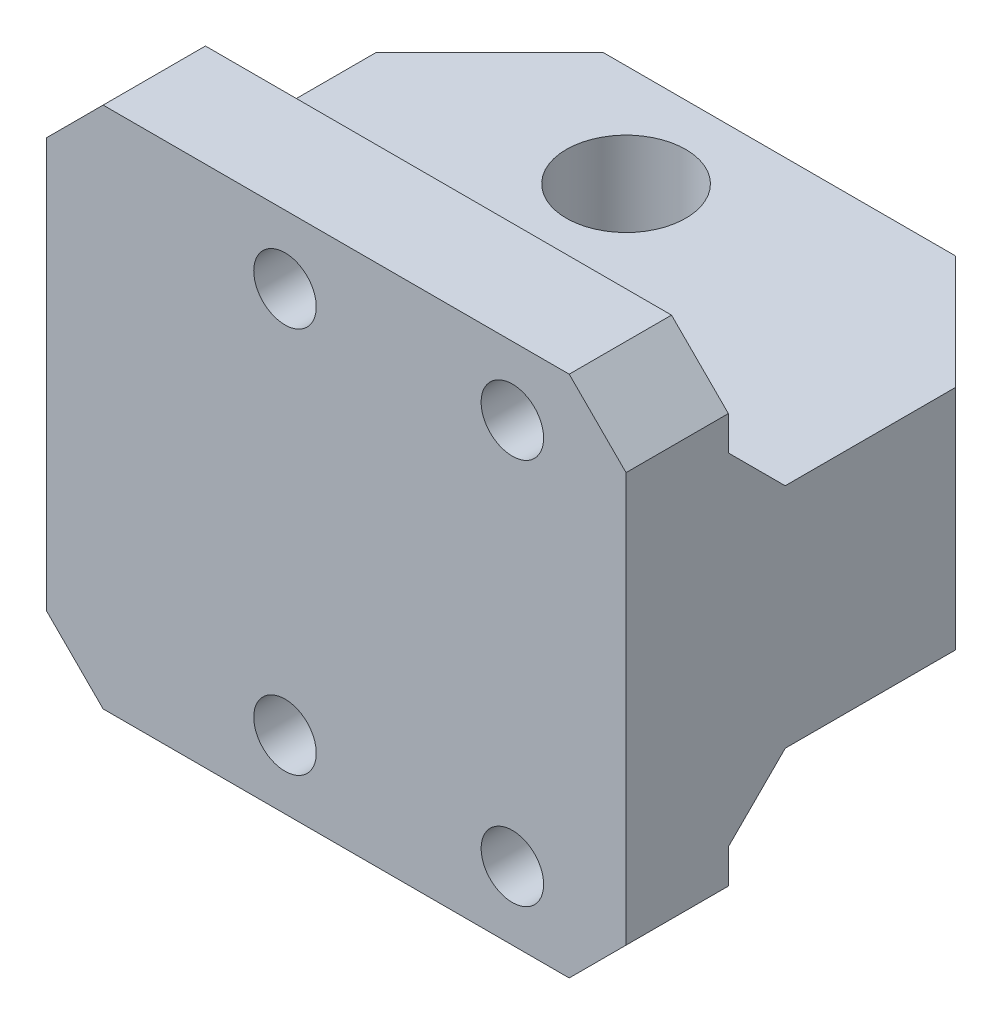
ISO-10303-21;
HEADER;
FILE_DESCRIPTION(('STEP AP214'),'2;1');
FILE_NAME('part.step','',(''),(''),'','','');
FILE_SCHEMA(('AUTOMOTIVE_DESIGN { 1 0 10303 214 1 1 1 1 }'));
ENDSEC;
DATA;
#1=APPLICATION_CONTEXT('core data for automotive mechanical design processes');
#2=APPLICATION_PROTOCOL_DEFINITION('international standard','automotive_design',2000,#1);
#3=PRODUCT_CONTEXT('',#1,'mechanical');
#4=PRODUCT('Part','Part','',(#3));
#5=PRODUCT_RELATED_PRODUCT_CATEGORY('part','',(#4));
#6=PRODUCT_DEFINITION_FORMATION('','',#4);
#7=PRODUCT_DEFINITION_CONTEXT('part definition',#1,'design');
#8=PRODUCT_DEFINITION('design','',#6,#7);
#9=PRODUCT_DEFINITION_SHAPE('','',#8);
#10=(LENGTH_UNIT() NAMED_UNIT(*) SI_UNIT(.MILLI.,.METRE.));
#11=(NAMED_UNIT(*) PLANE_ANGLE_UNIT() SI_UNIT($,.RADIAN.));
#12=(NAMED_UNIT(*) SI_UNIT($,.STERADIAN.) SOLID_ANGLE_UNIT());
#13=UNCERTAINTY_MEASURE_WITH_UNIT(LENGTH_MEASURE(1.E-05),#10,'distance_accuracy_value','');
#14=(GEOMETRIC_REPRESENTATION_CONTEXT(3) GLOBAL_UNCERTAINTY_ASSIGNED_CONTEXT((#13)) GLOBAL_UNIT_ASSIGNED_CONTEXT((#10,
#11,#12)) REPRESENTATION_CONTEXT('',''));
#15=CARTESIAN_POINT('',(0.,0.,0.));
#16=DIRECTION('',(0.,0.,1.));
#17=DIRECTION('',(1.,0.,0.));
#18=AXIS2_PLACEMENT_3D('',#15,#16,#17);
#19=CARTESIAN_POINT('',(0.,0.,-9.));
#20=DIRECTION('',(0.,0.,-1.));
#21=DIRECTION('',(1.,0.,0.));
#22=AXIS2_PLACEMENT_3D('',#19,#20,#21);
#23=PLANE('',#22);
#24=DIRECTION('',(0.,-1.,0.));
#25=VECTOR('',#24,1.);
#26=CARTESIAN_POINT('',(-21.,23.,-9.));
#27=LINE('',#26,#25);
#28=CARTESIAN_POINT('',(-21.,-15.,-9.));
#29=VERTEX_POINT('',#28);
#30=CARTESIAN_POINT('',(-21.,-18.,-9.));
#31=VERTEX_POINT('',#30);
#32=EDGE_CURVE('E276',#29,#31,#27,.T.);
#33=ORIENTED_EDGE('',*,*,#32,.F.);
#34=DIRECTION('',(1.,0.,0.));
#35=VECTOR('',#34,1.);
#36=CARTESIAN_POINT('',(30.,-15.,-9.));
#37=LINE('',#36,#35);
#38=CARTESIAN_POINT('',(-3.74999999999965,-15.,-9.));
#39=VERTEX_POINT('',#38);
#40=EDGE_CURVE('E240',#29,#39,#37,.T.);
#41=ORIENTED_EDGE('',*,*,#40,.T.);
#42=CARTESIAN_POINT('',(3.35668992601512E-13,-17.,-9.));
#43=DIRECTION('',(0.,0.,1.));
#44=DIRECTION('',(1.,0.,0.));
#45=AXIS2_PLACEMENT_3D('',#42,#43,#44);
#46=CIRCLE('',#45,4.25);
#47=CARTESIAN_POINT('',(3.75000000000033,-15.,-9.));
#48=VERTEX_POINT('',#47);
#49=EDGE_CURVE('E381',#39,#48,#46,.T.);
#50=ORIENTED_EDGE('',*,*,#49,.T.);
#51=DIRECTION('',(1.,0.,0.));
#52=VECTOR('',#51,1.);
#53=CARTESIAN_POINT('',(30.,-15.,-9.));
#54=LINE('',#53,#52);
#55=CARTESIAN_POINT('',(16.2500000000003,-15.,-9.));
#56=VERTEX_POINT('',#55);
#57=EDGE_CURVE('E238',#48,#56,#54,.T.);
#58=ORIENTED_EDGE('',*,*,#57,.T.);
#59=CARTESIAN_POINT('',(20.0000000000003,-17.,-9.));
#60=DIRECTION('',(0.,0.,1.));
#61=DIRECTION('',(1.,0.,0.));
#62=AXIS2_PLACEMENT_3D('',#59,#60,#61);
#63=CIRCLE('',#62,4.25);
#64=CARTESIAN_POINT('',(23.7500000000003,-15.,-9.));
#65=VERTEX_POINT('',#64);
#66=EDGE_CURVE('E260',#56,#65,#63,.T.);
#67=ORIENTED_EDGE('',*,*,#66,.T.);
#68=DIRECTION('',(1.,0.,0.));
#69=VECTOR('',#68,1.);
#70=CARTESIAN_POINT('',(30.,-15.,-9.));
#71=LINE('',#70,#69);
#72=CARTESIAN_POINT('',(30.,-15.,-9.));
#73=VERTEX_POINT('',#72);
#74=EDGE_CURVE('E236',#65,#73,#71,.T.);
#75=ORIENTED_EDGE('',*,*,#74,.T.);
#76=DIRECTION('',(0.,1.,0.));
#77=VECTOR('',#76,1.);
#78=CARTESIAN_POINT('',(30.,23.,-9.));
#79=LINE('',#78,#77);
#80=CARTESIAN_POINT('',(30.,-18.,-9.));
#81=VERTEX_POINT('',#80);
#82=EDGE_CURVE('E298',#81,#73,#79,.T.);
#83=ORIENTED_EDGE('',*,*,#82,.F.);
#84=DIRECTION('',(0.707106781186549,0.707106781186546,0.));
#85=VECTOR('',#84,1.);
#86=CARTESIAN_POINT('',(23.9999999999999,-24.,-9.));
#87=LINE('',#86,#85);
#88=CARTESIAN_POINT('',(25.,-23.,-9.));
#89=VERTEX_POINT('',#88);
#90=EDGE_CURVE('E331',#81,#89,#87,.F.);
#91=ORIENTED_EDGE('',*,*,#90,.T.);
#92=DIRECTION('',(1.,0.,0.));
#93=VECTOR('',#92,1.);
#94=CARTESIAN_POINT('',(30.,-23.,-9.));
#95=LINE('',#94,#93);
#96=CARTESIAN_POINT('',(-16.,-23.,-9.));
#97=VERTEX_POINT('',#96);
#98=EDGE_CURVE('E182',#97,#89,#95,.T.);
#99=ORIENTED_EDGE('',*,*,#98,.F.);
#100=DIRECTION('',(0.707106781186547,-0.707106781186548,0.));
#101=VECTOR('',#100,1.);
#102=CARTESIAN_POINT('',(-19.5,-19.5,-9.));
#103=LINE('',#102,#101);
#104=EDGE_CURVE('E282',#97,#31,#103,.F.);
#105=ORIENTED_EDGE('',*,*,#104,.T.);
#106=EDGE_LOOP('',(#33,#41,#50,#58,#67,#75,#83,#91,#99,#105));
#107=FACE_BOUND('',#106,.T.);
#108=ADVANCED_FACE('F33',(#107),#23,.T.);
#109=CARTESIAN_POINT('',(30.,15.,-9.));
#110=VERTEX_POINT('',#109);
#111=CARTESIAN_POINT('',(30.,18.,-9.));
#112=VERTEX_POINT('',#111);
#113=EDGE_CURVE('E297',#110,#112,#79,.T.);
#114=ORIENTED_EDGE('',*,*,#113,.F.);
#115=DIRECTION('',(-1.,0.,0.));
#116=VECTOR('',#115,1.);
#117=CARTESIAN_POINT('',(-21.,15.,-9.));
#118=LINE('',#117,#116);
#119=CARTESIAN_POINT('',(23.75,15.,-9.));
#120=VERTEX_POINT('',#119);
#121=EDGE_CURVE('E231',#110,#120,#118,.T.);
#122=ORIENTED_EDGE('',*,*,#121,.T.);
#123=CARTESIAN_POINT('',(20.,17.,-9.));
#124=DIRECTION('',(0.,0.,1.));
#125=DIRECTION('',(1.,0.,0.));
#126=AXIS2_PLACEMENT_3D('',#123,#124,#125);
#127=CIRCLE('',#126,4.25);
#128=CARTESIAN_POINT('',(16.25,15.,-9.));
#129=VERTEX_POINT('',#128);
#130=EDGE_CURVE('E384',#120,#129,#127,.T.);
#131=ORIENTED_EDGE('',*,*,#130,.T.);
#132=DIRECTION('',(-1.,0.,0.));
#133=VECTOR('',#132,1.);
#134=CARTESIAN_POINT('',(-21.,15.,-9.));
#135=LINE('',#134,#133);
#136=CARTESIAN_POINT('',(3.74999999999997,15.,-9.));
#137=VERTEX_POINT('',#136);
#138=EDGE_CURVE('E229',#129,#137,#135,.T.);
#139=ORIENTED_EDGE('',*,*,#138,.T.);
#140=CARTESIAN_POINT('',(0.,17.,-9.));
#141=DIRECTION('',(0.,0.,1.));
#142=DIRECTION('',(1.,0.,0.));
#143=AXIS2_PLACEMENT_3D('',#140,#141,#142);
#144=CIRCLE('',#143,4.25);
#145=CARTESIAN_POINT('',(-3.75000000000001,15.,-9.));
#146=VERTEX_POINT('',#145);
#147=EDGE_CURVE('E294',#137,#146,#144,.T.);
#148=ORIENTED_EDGE('',*,*,#147,.T.);
#149=DIRECTION('',(-1.,0.,0.));
#150=VECTOR('',#149,1.);
#151=CARTESIAN_POINT('',(-21.,15.,-9.));
#152=LINE('',#151,#150);
#153=CARTESIAN_POINT('',(-21.,15.,-9.));
#154=VERTEX_POINT('',#153);
#155=EDGE_CURVE('E227',#146,#154,#152,.T.);
#156=ORIENTED_EDGE('',*,*,#155,.T.);
#157=CARTESIAN_POINT('',(-21.,18.,-9.));
#158=VERTEX_POINT('',#157);
#159=EDGE_CURVE('E284',#158,#154,#27,.T.);
#160=ORIENTED_EDGE('',*,*,#159,.F.);
#161=DIRECTION('',(-0.707106781186549,-0.707106781186546,0.));
#162=VECTOR('',#161,1.);
#163=CARTESIAN_POINT('',(-19.5,19.5,-9.));
#164=LINE('',#163,#162);
#165=CARTESIAN_POINT('',(-16.,23.,-9.));
#166=VERTEX_POINT('',#165);
#167=EDGE_CURVE('E329',#158,#166,#164,.F.);
#168=ORIENTED_EDGE('',*,*,#167,.T.);
#169=DIRECTION('',(-1.,0.,0.));
#170=VECTOR('',#169,1.);
#171=CARTESIAN_POINT('',(-21.,23.,-9.));
#172=LINE('',#171,#170);
#173=CARTESIAN_POINT('',(25.,23.,-9.));
#174=VERTEX_POINT('',#173);
#175=EDGE_CURVE('E288',#174,#166,#172,.T.);
#176=ORIENTED_EDGE('',*,*,#175,.F.);
#177=DIRECTION('',(-0.707106781186546,0.707106781186549,0.));
#178=VECTOR('',#177,1.);
#179=CARTESIAN_POINT('',(24.,24.,-9.));
#180=LINE('',#179,#178);
#181=EDGE_CURVE('E196',#174,#112,#180,.F.);
#182=ORIENTED_EDGE('',*,*,#181,.T.);
#183=EDGE_LOOP('',(#114,#122,#131,#139,#148,#156,#160,#168,#176,#182));
#184=FACE_BOUND('',#183,.T.);
#185=ADVANCED_FACE('F340',(#184),#23,.T.);
#186=CARTESIAN_POINT('',(20.,17.,9.));
#187=DIRECTION('',(0.,0.,-1.));
#188=DIRECTION('',(-1.,0.,0.));
#189=AXIS2_PLACEMENT_3D('',#186,#187,#188);
#190=CYLINDRICAL_SURFACE('',#189,2.75);
#191=CARTESIAN_POINT('',(20.,17.,0.));
#192=DIRECTION('',(0.,0.,-1.));
#193=DIRECTION('',(-1.,0.,0.));
#194=AXIS2_PLACEMENT_3D('',#191,#192,#193);
#195=CIRCLE('',#194,2.75);
#196=CARTESIAN_POINT('',(17.25,17.,0.));
#197=VERTEX_POINT('',#196);
#198=EDGE_CURVE('E363',#197,#197,#195,.T.);
#199=ORIENTED_EDGE('',*,*,#198,.F.);
#200=EDGE_LOOP('',(#199));
#201=FACE_BOUND('',#200,.T.);
#202=CARTESIAN_POINT('',(20.,17.,-4.));
#203=DIRECTION('',(0.,0.,-1.));
#204=DIRECTION('',(-1.,0.,0.));
#205=AXIS2_PLACEMENT_3D('',#202,#203,#204);
#206=CIRCLE('',#205,2.75);
#207=CARTESIAN_POINT('',(17.25,17.,-4.));
#208=VERTEX_POINT('',#207);
#209=EDGE_CURVE('E317',#208,#208,#206,.T.);
#210=ORIENTED_EDGE('',*,*,#209,.T.);
#211=EDGE_LOOP('',(#210));
#212=FACE_BOUND('',#211,.T.);
#213=ADVANCED_FACE('F445',(#201,#212),#190,.F.);
#214=CARTESIAN_POINT('',(20.0000000000003,-17.,9.));
#215=DIRECTION('',(0.,0.,-1.));
#216=DIRECTION('',(-1.,0.,0.));
#217=AXIS2_PLACEMENT_3D('',#214,#215,#216);
#218=CYLINDRICAL_SURFACE('',#217,2.75);
#219=CARTESIAN_POINT('',(20.0000000000003,-17.,0.));
#220=DIRECTION('',(0.,0.,-1.));
#221=DIRECTION('',(-1.,0.,0.));
#222=AXIS2_PLACEMENT_3D('',#219,#220,#221);
#223=CIRCLE('',#222,2.75);
#224=CARTESIAN_POINT('',(17.2500000000003,-17.,0.));
#225=VERTEX_POINT('',#224);
#226=EDGE_CURVE('E360',#225,#225,#223,.T.);
#227=ORIENTED_EDGE('',*,*,#226,.F.);
#228=EDGE_LOOP('',(#227));
#229=FACE_BOUND('',#228,.T.);
#230=CARTESIAN_POINT('',(20.0000000000003,-17.,-4.));
#231=DIRECTION('',(0.,0.,-1.));
#232=DIRECTION('',(-1.,0.,0.));
#233=AXIS2_PLACEMENT_3D('',#230,#231,#232);
#234=CIRCLE('',#233,2.75);
#235=CARTESIAN_POINT('',(17.2500000000003,-17.,-4.));
#236=VERTEX_POINT('',#235);
#237=EDGE_CURVE('E313',#236,#236,#234,.T.);
#238=ORIENTED_EDGE('',*,*,#237,.T.);
#239=EDGE_LOOP('',(#238));
#240=FACE_BOUND('',#239,.T.);
#241=ADVANCED_FACE('F454',(#229,#240),#218,.F.);
#242=CARTESIAN_POINT('',(3.35182208528941E-13,-17.,9.));
#243=DIRECTION('',(0.,0.,-1.));
#244=DIRECTION('',(-1.,0.,0.));
#245=AXIS2_PLACEMENT_3D('',#242,#243,#244);
#246=CYLINDRICAL_SURFACE('',#245,2.75);
#247=CARTESIAN_POINT('',(3.35182208528941E-13,-17.,0.));
#248=DIRECTION('',(0.,0.,-1.));
#249=DIRECTION('',(-1.,0.,0.));
#250=AXIS2_PLACEMENT_3D('',#247,#248,#249);
#251=CIRCLE('',#250,2.75);
#252=CARTESIAN_POINT('',(-2.74999999999966,-17.,0.));
#253=VERTEX_POINT('',#252);
#254=EDGE_CURVE('E352',#253,#253,#251,.T.);
#255=ORIENTED_EDGE('',*,*,#254,.F.);
#256=EDGE_LOOP('',(#255));
#257=FACE_BOUND('',#256,.T.);
#258=CARTESIAN_POINT('',(3.35182208528941E-13,-17.,-4.));
#259=DIRECTION('',(0.,0.,-1.));
#260=DIRECTION('',(-1.,0.,0.));
#261=AXIS2_PLACEMENT_3D('',#258,#259,#260);
#262=CIRCLE('',#261,2.75);
#263=CARTESIAN_POINT('',(-2.74999999999966,-17.,-4.));
#264=VERTEX_POINT('',#263);
#265=EDGE_CURVE('E310',#264,#264,#262,.T.);
#266=ORIENTED_EDGE('',*,*,#265,.T.);
#267=EDGE_LOOP('',(#266));
#268=FACE_BOUND('',#267,.T.);
#269=ADVANCED_FACE('F450',(#257,#268),#246,.F.);
#270=CARTESIAN_POINT('',(0.,17.,9.));
#271=DIRECTION('',(0.,0.,-1.));
#272=DIRECTION('',(-1.,0.,0.));
#273=AXIS2_PLACEMENT_3D('',#270,#271,#272);
#274=CYLINDRICAL_SURFACE('',#273,2.75);
#275=CARTESIAN_POINT('',(0.,17.,0.));
#276=DIRECTION('',(0.,0.,-1.));
#277=DIRECTION('',(-1.,0.,0.));
#278=AXIS2_PLACEMENT_3D('',#275,#276,#277);
#279=CIRCLE('',#278,2.75);
#280=CARTESIAN_POINT('',(-2.75000000000002,17.,0.));
#281=VERTEX_POINT('',#280);
#282=EDGE_CURVE('E348',#281,#281,#279,.T.);
#283=ORIENTED_EDGE('',*,*,#282,.F.);
#284=EDGE_LOOP('',(#283));
#285=FACE_BOUND('',#284,.T.);
#286=CARTESIAN_POINT('',(0.,17.,-4.));
#287=DIRECTION('',(0.,0.,-1.));
#288=DIRECTION('',(-1.,0.,0.));
#289=AXIS2_PLACEMENT_3D('',#286,#287,#288);
#290=CIRCLE('',#289,2.75);
#291=CARTESIAN_POINT('',(-2.75000000000002,17.,-4.));
#292=VERTEX_POINT('',#291);
#293=EDGE_CURVE('E285',#292,#292,#290,.T.);
#294=ORIENTED_EDGE('',*,*,#293,.T.);
#295=EDGE_LOOP('',(#294));
#296=FACE_BOUND('',#295,.T.);
#297=ADVANCED_FACE('F453',(#285,#296),#274,.F.);
#298=CARTESIAN_POINT('',(-21.,23.,9.));
#299=DIRECTION('',(1.,0.,0.));
#300=DIRECTION('',(0.,0.,-1.));
#301=AXIS2_PLACEMENT_3D('',#298,#299,#300);
#302=PLANE('',#301);
#303=DIRECTION('',(0.,0.,1.));
#304=VECTOR('',#303,1.);
#305=CARTESIAN_POINT('',(-21.,-18.,9.));
#306=LINE('',#305,#304);
#307=CARTESIAN_POINT('',(-21.,-18.,0.));
#308=VERTEX_POINT('',#307);
#309=EDGE_CURVE('E321',#31,#308,#306,.T.);
#310=ORIENTED_EDGE('',*,*,#309,.T.);
#311=DIRECTION('',(0.,1.,0.));
#312=VECTOR('',#311,1.);
#313=CARTESIAN_POINT('',(-21.,23.,0.));
#314=LINE('',#313,#312);
#315=CARTESIAN_POINT('',(-21.,18.,0.));
#316=VERTEX_POINT('',#315);
#317=EDGE_CURVE('E347',#308,#316,#314,.T.);
#318=ORIENTED_EDGE('',*,*,#317,.T.);
#319=DIRECTION('',(0.,0.,-1.));
#320=VECTOR('',#319,1.);
#321=CARTESIAN_POINT('',(-21.,18.,9.));
#322=LINE('',#321,#320);
#323=EDGE_CURVE('E308',#316,#158,#322,.T.);
#324=ORIENTED_EDGE('',*,*,#323,.T.);
#325=ORIENTED_EDGE('',*,*,#159,.T.);
#326=DIRECTION('',(0.,0.707106781186544,0.707106781186551));
#327=VECTOR('',#326,1.);
#328=CARTESIAN_POINT('',(-21.,27.9999999999999,4.00000000000011));
#329=LINE('',#328,#327);
#330=CARTESIAN_POINT('',(-21.,10.,-14.));
#331=VERTEX_POINT('',#330);
#332=EDGE_CURVE('E248',#154,#331,#329,.F.);
#333=ORIENTED_EDGE('',*,*,#332,.T.);
#334=DIRECTION('',(0.,0.,1.));
#335=VECTOR('',#334,1.);
#336=CARTESIAN_POINT('',(-21.,10.,-39.));
#337=LINE('',#336,#335);
#338=CARTESIAN_POINT('',(-21.,10.,-29.));
#339=VERTEX_POINT('',#338);
#340=EDGE_CURVE('E378',#339,#331,#337,.T.);
#341=ORIENTED_EDGE('',*,*,#340,.F.);
#342=DIRECTION('',(0.,-1.,0.));
#343=VECTOR('',#342,1.);
#344=CARTESIAN_POINT('',(-21.,23.,-29.));
#345=LINE('',#344,#343);
#346=CARTESIAN_POINT('',(-21.,-10.,-29.));
#347=VERTEX_POINT('',#346);
#348=EDGE_CURVE('E199',#339,#347,#345,.T.);
#349=ORIENTED_EDGE('',*,*,#348,.T.);
#350=DIRECTION('',(0.,0.,1.));
#351=VECTOR('',#350,1.);
#352=CARTESIAN_POINT('',(-21.,-10.,-39.));
#353=LINE('',#352,#351);
#354=CARTESIAN_POINT('',(-21.,-10.,-14.));
#355=VERTEX_POINT('',#354);
#356=EDGE_CURVE('E278',#347,#355,#353,.T.);
#357=ORIENTED_EDGE('',*,*,#356,.T.);
#358=DIRECTION('',(0.,0.707106781186544,-0.707106781186551));
#359=VECTOR('',#358,1.);
#360=CARTESIAN_POINT('',(-21.,-5.0000000000002,-18.9999999999999));
#361=LINE('',#360,#359);
#362=EDGE_CURVE('E11',#355,#29,#361,.F.);
#363=ORIENTED_EDGE('',*,*,#362,.T.);
#364=ORIENTED_EDGE('',*,*,#32,.T.);
#365=EDGE_LOOP('',(#310,#318,#324,#325,#333,#341,#349,#357,#363,#364));
#366=FACE_BOUND('',#365,.T.);
#367=ADVANCED_FACE('F275',(#366),#302,.F.);
#368=CARTESIAN_POINT('',(30.,-23.,9.));
#369=DIRECTION('',(0.,1.,0.));
#370=DIRECTION('',(-1.,0.,0.));
#371=AXIS2_PLACEMENT_3D('',#368,#369,#370);
#372=PLANE('',#371);
#373=DIRECTION('',(0.,0.,1.));
#374=VECTOR('',#373,1.);
#375=CARTESIAN_POINT('',(25.,-23.,9.));
#376=LINE('',#375,#374);
#377=CARTESIAN_POINT('',(25.,-23.,0.));
#378=VERTEX_POINT('',#377);
#379=EDGE_CURVE('E323',#89,#378,#376,.T.);
#380=ORIENTED_EDGE('',*,*,#379,.T.);
#381=DIRECTION('',(-1.,0.,0.));
#382=VECTOR('',#381,1.);
#383=CARTESIAN_POINT('',(30.,-23.,0.));
#384=LINE('',#383,#382);
#385=CARTESIAN_POINT('',(-16.,-23.,0.));
#386=VERTEX_POINT('',#385);
#387=EDGE_CURVE('E349',#378,#386,#384,.T.);
#388=ORIENTED_EDGE('',*,*,#387,.T.);
#389=DIRECTION('',(0.,0.,-1.));
#390=VECTOR('',#389,1.);
#391=CARTESIAN_POINT('',(-16.,-23.,9.));
#392=LINE('',#391,#390);
#393=EDGE_CURVE('E326',#386,#97,#392,.T.);
#394=ORIENTED_EDGE('',*,*,#393,.T.);
#395=ORIENTED_EDGE('',*,*,#98,.T.);
#396=EDGE_LOOP('',(#380,#388,#394,#395));
#397=FACE_BOUND('',#396,.T.);
#398=ADVANCED_FACE('F469',(#397),#372,.F.);
#399=CARTESIAN_POINT('',(30.,23.,9.));
#400=DIRECTION('',(-1.,0.,0.));
#401=DIRECTION('',(0.,0.,1.));
#402=AXIS2_PLACEMENT_3D('',#399,#400,#401);
#403=PLANE('',#402);
#404=DIRECTION('',(0.,0.,1.));
#405=VECTOR('',#404,1.);
#406=CARTESIAN_POINT('',(30.,18.,9.));
#407=LINE('',#406,#405);
#408=CARTESIAN_POINT('',(30.,18.,0.));
#409=VERTEX_POINT('',#408);
#410=EDGE_CURVE('E201',#112,#409,#407,.T.);
#411=ORIENTED_EDGE('',*,*,#410,.T.);
#412=DIRECTION('',(0.,-1.,0.));
#413=VECTOR('',#412,1.);
#414=CARTESIAN_POINT('',(30.,23.,0.));
#415=LINE('',#414,#413);
#416=CARTESIAN_POINT('',(30.,-18.,0.));
#417=VERTEX_POINT('',#416);
#418=EDGE_CURVE('E176',#409,#417,#415,.T.);
#419=ORIENTED_EDGE('',*,*,#418,.T.);
#420=DIRECTION('',(0.,0.,-1.));
#421=VECTOR('',#420,1.);
#422=CARTESIAN_POINT('',(30.,-18.,9.));
#423=LINE('',#422,#421);
#424=EDGE_CURVE('E197',#417,#81,#423,.T.);
#425=ORIENTED_EDGE('',*,*,#424,.T.);
#426=ORIENTED_EDGE('',*,*,#82,.T.);
#427=DIRECTION('',(0.,-0.707106781186544,0.707106781186551));
#428=VECTOR('',#427,1.);
#429=CARTESIAN_POINT('',(30.,-5.0000000000002,-18.9999999999999));
#430=LINE('',#429,#428);
#431=CARTESIAN_POINT('',(30.,-10.,-14.));
#432=VERTEX_POINT('',#431);
#433=EDGE_CURVE('E41',#73,#432,#430,.F.);
#434=ORIENTED_EDGE('',*,*,#433,.T.);
#435=DIRECTION('',(0.,0.,1.));
#436=VECTOR('',#435,1.);
#437=CARTESIAN_POINT('',(30.,-10.,-39.));
#438=LINE('',#437,#436);
#439=CARTESIAN_POINT('',(30.,-10.,-29.));
#440=VERTEX_POINT('',#439);
#441=EDGE_CURVE('E374',#440,#432,#438,.T.);
#442=ORIENTED_EDGE('',*,*,#441,.F.);
#443=DIRECTION('',(0.,1.,0.));
#444=VECTOR('',#443,1.);
#445=CARTESIAN_POINT('',(30.,23.,-29.));
#446=LINE('',#445,#444);
#447=CARTESIAN_POINT('',(30.,10.,-29.));
#448=VERTEX_POINT('',#447);
#449=EDGE_CURVE('E224',#440,#448,#446,.T.);
#450=ORIENTED_EDGE('',*,*,#449,.T.);
#451=DIRECTION('',(0.,0.,1.));
#452=VECTOR('',#451,1.);
#453=CARTESIAN_POINT('',(30.,10.,-39.));
#454=LINE('',#453,#452);
#455=CARTESIAN_POINT('',(30.,10.,-14.));
#456=VERTEX_POINT('',#455);
#457=EDGE_CURVE('E376',#448,#456,#454,.T.);
#458=ORIENTED_EDGE('',*,*,#457,.T.);
#459=DIRECTION('',(0.,-0.707106781186544,-0.707106781186551));
#460=VECTOR('',#459,1.);
#461=CARTESIAN_POINT('',(30.,27.9999999999999,4.00000000000011));
#462=LINE('',#461,#460);
#463=EDGE_CURVE('E250',#456,#110,#462,.F.);
#464=ORIENTED_EDGE('',*,*,#463,.T.);
#465=ORIENTED_EDGE('',*,*,#113,.T.);
#466=EDGE_LOOP('',(#411,#419,#425,#426,#434,#442,#450,#458,#464,#465));
#467=FACE_BOUND('',#466,.T.);
#468=ADVANCED_FACE('F333',(#467),#403,.F.);
#469=CARTESIAN_POINT('',(-21.,23.,9.));
#470=DIRECTION('',(0.,-1.,0.));
#471=DIRECTION('',(1.,0.,0.));
#472=AXIS2_PLACEMENT_3D('',#469,#470,#471);
#473=PLANE('',#472);
#474=DIRECTION('',(0.,0.,1.));
#475=VECTOR('',#474,1.);
#476=CARTESIAN_POINT('',(-16.,23.,9.));
#477=LINE('',#476,#475);
#478=CARTESIAN_POINT('',(-16.,23.,0.));
#479=VERTEX_POINT('',#478);
#480=EDGE_CURVE('E191',#166,#479,#477,.T.);
#481=ORIENTED_EDGE('',*,*,#480,.T.);
#482=DIRECTION('',(1.,0.,0.));
#483=VECTOR('',#482,1.);
#484=CARTESIAN_POINT('',(-21.,23.,0.));
#485=LINE('',#484,#483);
#486=CARTESIAN_POINT('',(25.,23.,0.));
#487=VERTEX_POINT('',#486);
#488=EDGE_CURVE('E173',#479,#487,#485,.T.);
#489=ORIENTED_EDGE('',*,*,#488,.T.);
#490=DIRECTION('',(0.,0.,-1.));
#491=VECTOR('',#490,1.);
#492=CARTESIAN_POINT('',(25.,23.,9.));
#493=LINE('',#492,#491);
#494=EDGE_CURVE('E188',#487,#174,#493,.T.);
#495=ORIENTED_EDGE('',*,*,#494,.T.);
#496=ORIENTED_EDGE('',*,*,#175,.T.);
#497=EDGE_LOOP('',(#481,#489,#495,#496));
#498=FACE_BOUND('',#497,.T.);
#499=ADVANCED_FACE('F186',(#498),#473,.F.);
#500=CARTESIAN_POINT('',(0.,17.,-4.));
#501=DIRECTION('',(0.,0.,-1.));
#502=DIRECTION('',(-1.,0.,0.));
#503=AXIS2_PLACEMENT_3D('',#500,#501,#502);
#504=CYLINDRICAL_SURFACE('',#503,4.25);
#505=CARTESIAN_POINT('',(0.,17.,-4.));
#506=DIRECTION('',(0.,0.,1.));
#507=DIRECTION('',(1.,0.,0.));
#508=AXIS2_PLACEMENT_3D('',#505,#506,#507);
#509=CIRCLE('',#508,4.25);
#510=CARTESIAN_POINT('',(4.24999999999998,17.,-4.));
#511=VERTEX_POINT('',#510);
#512=EDGE_CURVE('E290',#511,#511,#509,.T.);
#513=ORIENTED_EDGE('',*,*,#512,.T.);
#514=EDGE_LOOP('',(#513));
#515=FACE_BOUND('',#514,.T.);
#516=ORIENTED_EDGE('',*,*,#147,.F.);
#517=CARTESIAN_POINT('',(0.,17.,-6.99999999999996));
#518=DIRECTION('',(0.,0.707106781186551,-0.707106781186544));
#519=DIRECTION('',(0.,-0.707106781186544,-0.707106781186551));
#520=AXIS2_PLACEMENT_3D('',#517,#518,#519);
#521=ELLIPSE('',#520,6.01040764008569,4.25);
#522=EDGE_CURVE('E246',#137,#146,#521,.T.);
#523=ORIENTED_EDGE('',*,*,#522,.T.);
#524=EDGE_LOOP('',(#516,#523));
#525=FACE_BOUND('',#524,.T.);
#526=ADVANCED_FACE('F448',(#515,#525),#504,.F.);
#527=CARTESIAN_POINT('',(0.,17.,-4.));
#528=DIRECTION('',(0.,0.,-1.));
#529=DIRECTION('',(1.,0.,0.));
#530=AXIS2_PLACEMENT_3D('',#527,#528,#529);
#531=PLANE('',#530);
#532=ORIENTED_EDGE('',*,*,#293,.F.);
#533=EDGE_LOOP('',(#532));
#534=FACE_BOUND('',#533,.T.);
#535=ORIENTED_EDGE('',*,*,#512,.F.);
#536=EDGE_LOOP('',(#535));
#537=FACE_BOUND('',#536,.T.);
#538=ADVANCED_FACE('F650',(#534,#537),#531,.T.);
#539=CARTESIAN_POINT('',(3.35668992601512E-13,-17.,-4.));
#540=DIRECTION('',(0.,0.,-1.));
#541=DIRECTION('',(-1.,0.,0.));
#542=AXIS2_PLACEMENT_3D('',#539,#540,#541);
#543=CYLINDRICAL_SURFACE('',#542,4.25);
#544=CARTESIAN_POINT('',(3.35668992601512E-13,-17.,-4.));
#545=DIRECTION('',(0.,0.,1.));
#546=DIRECTION('',(1.,0.,0.));
#547=AXIS2_PLACEMENT_3D('',#544,#545,#546);
#548=CIRCLE('',#547,4.25);
#549=CARTESIAN_POINT('',(4.25000000000034,-17.,-4.));
#550=VERTEX_POINT('',#549);
#551=EDGE_CURVE('E269',#550,#550,#548,.T.);
#552=ORIENTED_EDGE('',*,*,#551,.T.);
#553=EDGE_LOOP('',(#552));
#554=FACE_BOUND('',#553,.T.);
#555=ORIENTED_EDGE('',*,*,#49,.F.);
#556=CARTESIAN_POINT('',(3.35668992601512E-13,-17.,-6.99999999999996));
#557=DIRECTION('',(0.,-0.707106781186551,-0.707106781186544));
#558=DIRECTION('',(0.,0.707106781186544,-0.707106781186551));
#559=AXIS2_PLACEMENT_3D('',#556,#557,#558);
#560=ELLIPSE('',#559,6.01040764008569,4.25);
#561=EDGE_CURVE('E252',#39,#48,#560,.T.);
#562=ORIENTED_EDGE('',*,*,#561,.T.);
#563=EDGE_LOOP('',(#555,#562));
#564=FACE_BOUND('',#563,.T.);
#565=ADVANCED_FACE('F658',(#554,#564),#543,.F.);
#566=CARTESIAN_POINT('',(3.35668992601512E-13,-17.,-4.));
#567=DIRECTION('',(0.,0.,-1.));
#568=DIRECTION('',(1.,0.,0.));
#569=AXIS2_PLACEMENT_3D('',#566,#567,#568);
#570=PLANE('',#569);
#571=ORIENTED_EDGE('',*,*,#265,.F.);
#572=EDGE_LOOP('',(#571));
#573=FACE_BOUND('',#572,.T.);
#574=ORIENTED_EDGE('',*,*,#551,.F.);
#575=EDGE_LOOP('',(#574));
#576=FACE_BOUND('',#575,.T.);
#577=ADVANCED_FACE('F667',(#573,#576),#570,.T.);
#578=CARTESIAN_POINT('',(20.0000000000003,-17.,-4.));
#579=DIRECTION('',(0.,0.,-1.));
#580=DIRECTION('',(-1.,0.,0.));
#581=AXIS2_PLACEMENT_3D('',#578,#579,#580);
#582=CYLINDRICAL_SURFACE('',#581,4.25);
#583=CARTESIAN_POINT('',(20.0000000000003,-17.,-4.));
#584=DIRECTION('',(0.,0.,1.));
#585=DIRECTION('',(1.,0.,0.));
#586=AXIS2_PLACEMENT_3D('',#583,#584,#585);
#587=CIRCLE('',#586,4.25);
#588=CARTESIAN_POINT('',(24.2500000000003,-17.,-4.));
#589=VERTEX_POINT('',#588);
#590=EDGE_CURVE('E268',#589,#589,#587,.T.);
#591=ORIENTED_EDGE('',*,*,#590,.T.);
#592=EDGE_LOOP('',(#591));
#593=FACE_BOUND('',#592,.T.);
#594=ORIENTED_EDGE('',*,*,#66,.F.);
#595=CARTESIAN_POINT('',(20.0000000000003,-17.,-6.99999999999996));
#596=DIRECTION('',(0.,-0.707106781186551,-0.707106781186544));
#597=DIRECTION('',(0.,0.707106781186544,-0.707106781186551));
#598=AXIS2_PLACEMENT_3D('',#595,#596,#597);
#599=ELLIPSE('',#598,6.01040764008569,4.25);
#600=EDGE_CURVE('E254',#56,#65,#599,.T.);
#601=ORIENTED_EDGE('',*,*,#600,.T.);
#602=EDGE_LOOP('',(#594,#601));
#603=FACE_BOUND('',#602,.T.);
#604=ADVANCED_FACE('F259',(#593,#603),#582,.F.);
#605=CARTESIAN_POINT('',(20.0000000000003,-17.,-4.));
#606=DIRECTION('',(0.,0.,-1.));
#607=DIRECTION('',(1.,0.,0.));
#608=AXIS2_PLACEMENT_3D('',#605,#606,#607);
#609=PLANE('',#608);
#610=ORIENTED_EDGE('',*,*,#237,.F.);
#611=EDGE_LOOP('',(#610));
#612=FACE_BOUND('',#611,.T.);
#613=ORIENTED_EDGE('',*,*,#590,.F.);
#614=EDGE_LOOP('',(#613));
#615=FACE_BOUND('',#614,.T.);
#616=ADVANCED_FACE('F428',(#612,#615),#609,.T.);
#617=CARTESIAN_POINT('',(20.,17.,-4.));
#618=DIRECTION('',(0.,0.,-1.));
#619=DIRECTION('',(-1.,0.,0.));
#620=AXIS2_PLACEMENT_3D('',#617,#618,#619);
#621=CYLINDRICAL_SURFACE('',#620,4.25);
#622=CARTESIAN_POINT('',(20.,17.,-4.));
#623=DIRECTION('',(0.,0.,1.));
#624=DIRECTION('',(1.,0.,0.));
#625=AXIS2_PLACEMENT_3D('',#622,#623,#624);
#626=CIRCLE('',#625,4.25);
#627=CARTESIAN_POINT('',(24.25,17.,-4.));
#628=VERTEX_POINT('',#627);
#629=EDGE_CURVE('E314',#628,#628,#626,.T.);
#630=ORIENTED_EDGE('',*,*,#629,.T.);
#631=EDGE_LOOP('',(#630));
#632=FACE_BOUND('',#631,.T.);
#633=ORIENTED_EDGE('',*,*,#130,.F.);
#634=CARTESIAN_POINT('',(20.,17.,-6.99999999999996));
#635=DIRECTION('',(0.,0.707106781186551,-0.707106781186544));
#636=DIRECTION('',(0.,-0.707106781186544,-0.707106781186551));
#637=AXIS2_PLACEMENT_3D('',#634,#635,#636);
#638=ELLIPSE('',#637,6.01040764008569,4.25);
#639=EDGE_CURVE('E244',#120,#129,#638,.T.);
#640=ORIENTED_EDGE('',*,*,#639,.T.);
#641=EDGE_LOOP('',(#633,#640));
#642=FACE_BOUND('',#641,.T.);
#643=ADVANCED_FACE('F425',(#632,#642),#621,.F.);
#644=CARTESIAN_POINT('',(20.,17.,-4.));
#645=DIRECTION('',(0.,0.,-1.));
#646=DIRECTION('',(1.,0.,0.));
#647=AXIS2_PLACEMENT_3D('',#644,#645,#646);
#648=PLANE('',#647);
#649=ORIENTED_EDGE('',*,*,#209,.F.);
#650=EDGE_LOOP('',(#649));
#651=FACE_BOUND('',#650,.T.);
#652=ORIENTED_EDGE('',*,*,#629,.F.);
#653=EDGE_LOOP('',(#652));
#654=FACE_BOUND('',#653,.T.);
#655=ADVANCED_FACE('F427',(#651,#654),#648,.T.);
#656=CARTESIAN_POINT('',(-21.,-18.,9.));
#657=DIRECTION('',(0.707106781186548,0.707106781186547,0.));
#658=DIRECTION('',(0.,0.,1.));
#659=AXIS2_PLACEMENT_3D('',#656,#657,#658);
#660=PLANE('',#659);
#661=ORIENTED_EDGE('',*,*,#104,.F.);
#662=ORIENTED_EDGE('',*,*,#393,.F.);
#663=DIRECTION('',(0.707106781186547,-0.707106781186548,0.));
#664=VECTOR('',#663,1.);
#665=CARTESIAN_POINT('',(-16.,-23.,0.));
#666=LINE('',#665,#664);
#667=EDGE_CURVE('E306',#386,#308,#666,.F.);
#668=ORIENTED_EDGE('',*,*,#667,.T.);
#669=ORIENTED_EDGE('',*,*,#309,.F.);
#670=EDGE_LOOP('',(#661,#662,#668,#669));
#671=FACE_BOUND('',#670,.T.);
#672=ADVANCED_FACE('F435',(#671),#660,.F.);
#673=CARTESIAN_POINT('',(25.,-23.,9.));
#674=DIRECTION('',(-0.707106781186546,0.707106781186549,0.));
#675=DIRECTION('',(0.,0.,1.));
#676=AXIS2_PLACEMENT_3D('',#673,#674,#675);
#677=PLANE('',#676);
#678=ORIENTED_EDGE('',*,*,#90,.F.);
#679=ORIENTED_EDGE('',*,*,#424,.F.);
#680=DIRECTION('',(0.707106781186549,0.707106781186546,0.));
#681=VECTOR('',#680,1.);
#682=CARTESIAN_POINT('',(30.,-18.,0.));
#683=LINE('',#682,#681);
#684=EDGE_CURVE('E303',#417,#378,#683,.F.);
#685=ORIENTED_EDGE('',*,*,#684,.T.);
#686=ORIENTED_EDGE('',*,*,#379,.F.);
#687=EDGE_LOOP('',(#678,#679,#685,#686));
#688=FACE_BOUND('',#687,.T.);
#689=ADVANCED_FACE('F477',(#688),#677,.F.);
#690=CARTESIAN_POINT('',(-16.,23.,9.));
#691=DIRECTION('',(0.707106781186546,-0.707106781186549,0.));
#692=DIRECTION('',(0.,0.,1.));
#693=AXIS2_PLACEMENT_3D('',#690,#691,#692);
#694=PLANE('',#693);
#695=ORIENTED_EDGE('',*,*,#167,.F.);
#696=ORIENTED_EDGE('',*,*,#323,.F.);
#697=DIRECTION('',(-0.707106781186549,-0.707106781186547,0.));
#698=VECTOR('',#697,1.);
#699=CARTESIAN_POINT('',(-21.,18.,0.));
#700=LINE('',#699,#698);
#701=EDGE_CURVE('E181',#316,#479,#700,.F.);
#702=ORIENTED_EDGE('',*,*,#701,.T.);
#703=ORIENTED_EDGE('',*,*,#480,.F.);
#704=EDGE_LOOP('',(#695,#696,#702,#703));
#705=FACE_BOUND('',#704,.T.);
#706=ADVANCED_FACE('F344',(#705),#694,.F.);
#707=CARTESIAN_POINT('',(30.,18.,9.));
#708=DIRECTION('',(-0.707106781186549,-0.707106781186546,0.));
#709=DIRECTION('',(0.,0.,1.));
#710=AXIS2_PLACEMENT_3D('',#707,#708,#709);
#711=PLANE('',#710);
#712=ORIENTED_EDGE('',*,*,#181,.F.);
#713=ORIENTED_EDGE('',*,*,#494,.F.);
#714=DIRECTION('',(-0.707106781186546,0.707106781186549,0.));
#715=VECTOR('',#714,1.);
#716=CARTESIAN_POINT('',(25.,23.,0.));
#717=LINE('',#716,#715);
#718=EDGE_CURVE('E170',#487,#409,#717,.F.);
#719=ORIENTED_EDGE('',*,*,#718,.T.);
#720=ORIENTED_EDGE('',*,*,#410,.F.);
#721=EDGE_LOOP('',(#712,#713,#719,#720));
#722=FACE_BOUND('',#721,.T.);
#723=ADVANCED_FACE('F194',(#722),#711,.F.);
#724=CARTESIAN_POINT('',(-21.,10.,-39.));
#725=DIRECTION('',(0.,1.,0.));
#726=DIRECTION('',(-1.,0.,0.));
#727=AXIS2_PLACEMENT_3D('',#724,#725,#726);
#728=PLANE('',#727);
#729=CARTESIAN_POINT('',(0.,10.,-30.));
#730=DIRECTION('',(0.,-1.,0.));
#731=DIRECTION('',(-1.,0.,0.));
#732=AXIS2_PLACEMENT_3D('',#729,#730,#731);
#733=CIRCLE('',#732,5.25);
#734=CARTESIAN_POINT('',(-5.25,10.,-30.));
#735=VERTEX_POINT('',#734);
#736=EDGE_CURVE('E209',#735,#735,#733,.T.);
#737=ORIENTED_EDGE('',*,*,#736,.T.);
#738=EDGE_LOOP('',(#737));
#739=FACE_BOUND('',#738,.T.);
#740=ORIENTED_EDGE('',*,*,#340,.T.);
#741=DIRECTION('',(1.,0.,0.));
#742=VECTOR('',#741,1.);
#743=CARTESIAN_POINT('',(30.,10.,-14.));
#744=LINE('',#743,#742);
#745=EDGE_CURVE('E234',#331,#456,#744,.T.);
#746=ORIENTED_EDGE('',*,*,#745,.T.);
#747=ORIENTED_EDGE('',*,*,#457,.F.);
#748=DIRECTION('',(0.707106781186547,0.,0.707106781186548));
#749=VECTOR('',#748,1.);
#750=CARTESIAN_POINT('',(-0.499999999999938,10.,-59.5));
#751=LINE('',#750,#749);
#752=CARTESIAN_POINT('',(20.,10.,-39.));
#753=VERTEX_POINT('',#752);
#754=EDGE_CURVE('E220',#448,#753,#751,.F.);
#755=ORIENTED_EDGE('',*,*,#754,.T.);
#756=DIRECTION('',(-1.,0.,0.));
#757=VECTOR('',#756,1.);
#758=CARTESIAN_POINT('',(-21.,10.,-39.));
#759=LINE('',#758,#757);
#760=CARTESIAN_POINT('',(-11.,10.,-39.));
#761=VERTEX_POINT('',#760);
#762=EDGE_CURVE('E208',#753,#761,#759,.T.);
#763=ORIENTED_EDGE('',*,*,#762,.T.);
#764=DIRECTION('',(0.707106781186546,0.,-0.707106781186549));
#765=VECTOR('',#764,1.);
#766=CARTESIAN_POINT('',(-16.,10.,-34.));
#767=LINE('',#766,#765);
#768=EDGE_CURVE('E222',#761,#339,#767,.F.);
#769=ORIENTED_EDGE('',*,*,#768,.T.);
#770=EDGE_LOOP('',(#740,#746,#747,#755,#763,#769));
#771=FACE_BOUND('',#770,.T.);
#772=ADVANCED_FACE('F407',(#739,#771),#728,.T.);
#773=CARTESIAN_POINT('',(-21.,-10.,-39.));
#774=DIRECTION('',(0.,-1.,0.));
#775=DIRECTION('',(1.,0.,0.));
#776=AXIS2_PLACEMENT_3D('',#773,#774,#775);
#777=PLANE('',#776);
#778=CARTESIAN_POINT('',(0.,-10.,-30.));
#779=DIRECTION('',(0.,-1.,0.));
#780=DIRECTION('',(1.,0.,0.));
#781=AXIS2_PLACEMENT_3D('',#778,#779,#780);
#782=CIRCLE('',#781,5.25);
#783=CARTESIAN_POINT('',(5.25,-10.,-30.));
#784=VERTEX_POINT('',#783);
#785=EDGE_CURVE('E205',#784,#784,#782,.F.);
#786=ORIENTED_EDGE('',*,*,#785,.T.);
#787=EDGE_LOOP('',(#786));
#788=FACE_BOUND('',#787,.T.);
#789=ORIENTED_EDGE('',*,*,#441,.T.);
#790=DIRECTION('',(-1.,0.,0.));
#791=VECTOR('',#790,1.);
#792=CARTESIAN_POINT('',(-21.,-10.,-14.));
#793=LINE('',#792,#791);
#794=EDGE_CURVE('E54',#432,#355,#793,.T.);
#795=ORIENTED_EDGE('',*,*,#794,.T.);
#796=ORIENTED_EDGE('',*,*,#356,.F.);
#797=DIRECTION('',(-0.707106781186546,0.,0.707106781186549));
#798=VECTOR('',#797,1.);
#799=CARTESIAN_POINT('',(-16.,-10.,-34.));
#800=LINE('',#799,#798);
#801=CARTESIAN_POINT('',(-11.,-10.,-39.));
#802=VERTEX_POINT('',#801);
#803=EDGE_CURVE('E214',#347,#802,#800,.F.);
#804=ORIENTED_EDGE('',*,*,#803,.T.);
#805=DIRECTION('',(1.,0.,0.));
#806=VECTOR('',#805,1.);
#807=CARTESIAN_POINT('',(-21.,-10.,-39.));
#808=LINE('',#807,#806);
#809=CARTESIAN_POINT('',(20.,-10.,-39.));
#810=VERTEX_POINT('',#809);
#811=EDGE_CURVE('E370',#802,#810,#808,.T.);
#812=ORIENTED_EDGE('',*,*,#811,.T.);
#813=DIRECTION('',(-0.707106781186547,0.,-0.707106781186548));
#814=VECTOR('',#813,1.);
#815=CARTESIAN_POINT('',(-0.499999999999938,-10.,-59.5));
#816=LINE('',#815,#814);
#817=EDGE_CURVE('E212',#810,#440,#816,.F.);
#818=ORIENTED_EDGE('',*,*,#817,.T.);
#819=EDGE_LOOP('',(#789,#795,#796,#804,#812,#818));
#820=FACE_BOUND('',#819,.T.);
#821=ADVANCED_FACE('F414',(#788,#820),#777,.T.);
#822=CARTESIAN_POINT('',(0.,0.,-39.));
#823=DIRECTION('',(0.,0.,1.));
#824=DIRECTION('',(-1.,0.,0.));
#825=AXIS2_PLACEMENT_3D('',#822,#823,#824);
#826=PLANE('',#825);
#827=ORIENTED_EDGE('',*,*,#811,.F.);
#828=DIRECTION('',(0.,1.,0.));
#829=VECTOR('',#828,1.);
#830=CARTESIAN_POINT('',(-11.,0.,-39.));
#831=LINE('',#830,#829);
#832=EDGE_CURVE('E218',#802,#761,#831,.T.);
#833=ORIENTED_EDGE('',*,*,#832,.T.);
#834=ORIENTED_EDGE('',*,*,#762,.F.);
#835=DIRECTION('',(0.,-1.,0.));
#836=VECTOR('',#835,1.);
#837=CARTESIAN_POINT('',(20.,0.,-39.));
#838=LINE('',#837,#836);
#839=EDGE_CURVE('E216',#753,#810,#838,.T.);
#840=ORIENTED_EDGE('',*,*,#839,.T.);
#841=EDGE_LOOP('',(#827,#833,#834,#840));
#842=FACE_BOUND('',#841,.T.);
#843=ADVANCED_FACE('F418',(#842),#826,.F.);
#844=CARTESIAN_POINT('',(0.,-23.,-30.));
#845=DIRECTION('',(0.,1.,0.));
#846=DIRECTION('',(-1.,0.,0.));
#847=AXIS2_PLACEMENT_3D('',#844,#845,#846);
#848=CYLINDRICAL_SURFACE('',#847,5.25);
#849=ORIENTED_EDGE('',*,*,#785,.F.);
#850=EDGE_LOOP('',(#849));
#851=FACE_BOUND('',#850,.T.);
#852=ORIENTED_EDGE('',*,*,#736,.F.);
#853=EDGE_LOOP('',(#852));
#854=FACE_BOUND('',#853,.T.);
#855=ADVANCED_FACE('F488',(#851,#854),#848,.F.);
#856=CARTESIAN_POINT('',(-21.,23.,-29.));
#857=DIRECTION('',(0.707106781186549,0.,0.707106781186546));
#858=DIRECTION('',(0.,-1.,0.));
#859=AXIS2_PLACEMENT_3D('',#856,#857,#858);
#860=PLANE('',#859);
#861=ORIENTED_EDGE('',*,*,#768,.F.);
#862=ORIENTED_EDGE('',*,*,#832,.F.);
#863=ORIENTED_EDGE('',*,*,#803,.F.);
#864=ORIENTED_EDGE('',*,*,#348,.F.);
#865=EDGE_LOOP('',(#861,#862,#863,#864));
#866=FACE_BOUND('',#865,.T.);
#867=ADVANCED_FACE('F413',(#866),#860,.F.);
#868=CARTESIAN_POINT('',(30.,23.,-29.));
#869=DIRECTION('',(-0.707106781186549,0.,0.707106781186547));
#870=DIRECTION('',(0.,1.,0.));
#871=AXIS2_PLACEMENT_3D('',#868,#869,#870);
#872=PLANE('',#871);
#873=ORIENTED_EDGE('',*,*,#817,.F.);
#874=ORIENTED_EDGE('',*,*,#839,.F.);
#875=ORIENTED_EDGE('',*,*,#754,.F.);
#876=ORIENTED_EDGE('',*,*,#449,.F.);
#877=EDGE_LOOP('',(#873,#874,#875,#876));
#878=FACE_BOUND('',#877,.T.);
#879=ADVANCED_FACE('F421',(#878),#872,.F.);
#880=CARTESIAN_POINT('',(0.,15.,-9.));
#881=DIRECTION('',(0.,0.707106781186551,-0.707106781186544));
#882=DIRECTION('',(1.,0.,0.));
#883=AXIS2_PLACEMENT_3D('',#880,#881,#882);
#884=PLANE('',#883);
#885=ORIENTED_EDGE('',*,*,#463,.F.);
#886=ORIENTED_EDGE('',*,*,#745,.F.);
#887=ORIENTED_EDGE('',*,*,#332,.F.);
#888=ORIENTED_EDGE('',*,*,#155,.F.);
#889=ORIENTED_EDGE('',*,*,#522,.F.);
#890=ORIENTED_EDGE('',*,*,#138,.F.);
#891=ORIENTED_EDGE('',*,*,#639,.F.);
#892=ORIENTED_EDGE('',*,*,#121,.F.);
#893=EDGE_LOOP('',(#885,#886,#887,#888,#889,#890,#891,#892));
#894=FACE_BOUND('',#893,.T.);
#895=ADVANCED_FACE('F402',(#894),#884,.T.);
#896=CARTESIAN_POINT('',(0.,-15.,-9.));
#897=DIRECTION('',(0.,-0.707106781186551,-0.707106781186544));
#898=DIRECTION('',(-1.,0.,0.));
#899=AXIS2_PLACEMENT_3D('',#896,#897,#898);
#900=PLANE('',#899);
#901=ORIENTED_EDGE('',*,*,#362,.F.);
#902=ORIENTED_EDGE('',*,*,#794,.F.);
#903=ORIENTED_EDGE('',*,*,#433,.F.);
#904=ORIENTED_EDGE('',*,*,#74,.F.);
#905=ORIENTED_EDGE('',*,*,#600,.F.);
#906=ORIENTED_EDGE('',*,*,#57,.F.);
#907=ORIENTED_EDGE('',*,*,#561,.F.);
#908=ORIENTED_EDGE('',*,*,#40,.F.);
#909=EDGE_LOOP('',(#901,#902,#903,#904,#905,#906,#907,#908));
#910=FACE_BOUND('',#909,.T.);
#911=ADVANCED_FACE('F35',(#910),#900,.T.);
#912=CARTESIAN_POINT('',(0.,0.,0.));
#913=DIRECTION('',(0.,0.,-1.));
#914=DIRECTION('',(-1.,0.,0.));
#915=AXIS2_PLACEMENT_3D('',#912,#913,#914);
#916=PLANE('',#915);
#917=ORIENTED_EDGE('',*,*,#198,.T.);
#918=EDGE_LOOP('',(#917));
#919=FACE_BOUND('',#918,.T.);
#920=ORIENTED_EDGE('',*,*,#226,.T.);
#921=EDGE_LOOP('',(#920));
#922=FACE_BOUND('',#921,.T.);
#923=ORIENTED_EDGE('',*,*,#254,.T.);
#924=EDGE_LOOP('',(#923));
#925=FACE_BOUND('',#924,.T.);
#926=ORIENTED_EDGE('',*,*,#282,.T.);
#927=EDGE_LOOP('',(#926));
#928=FACE_BOUND('',#927,.T.);
#929=ORIENTED_EDGE('',*,*,#667,.F.);
#930=ORIENTED_EDGE('',*,*,#387,.F.);
#931=ORIENTED_EDGE('',*,*,#684,.F.);
#932=ORIENTED_EDGE('',*,*,#418,.F.);
#933=ORIENTED_EDGE('',*,*,#718,.F.);
#934=ORIENTED_EDGE('',*,*,#488,.F.);
#935=ORIENTED_EDGE('',*,*,#701,.F.);
#936=ORIENTED_EDGE('',*,*,#317,.F.);
#937=EDGE_LOOP('',(#929,#930,#931,#932,#933,#934,#935,#936));
#938=FACE_BOUND('',#937,.T.);
#939=ADVANCED_FACE('F172',(#919,#922,#925,#928,#938),#916,.F.);
#940=CLOSED_SHELL('',(#108,#185,#213,#241,#269,#297,#367,#398,#468,#499,#526,#538,#565,#577,
#604,#616,#643,#655,#672,#689,#706,#723,#772,#821,#843,#855,#867,#879,#895,#911,#939));
#941=MANIFOLD_SOLID_BREP('B2',#940);
#942=ADVANCED_BREP_SHAPE_REPRESENTATION('',(#18,#941),#14);
#943=SHAPE_DEFINITION_REPRESENTATION(#9,#942);
ENDSEC;
END-ISO-10303-21;
